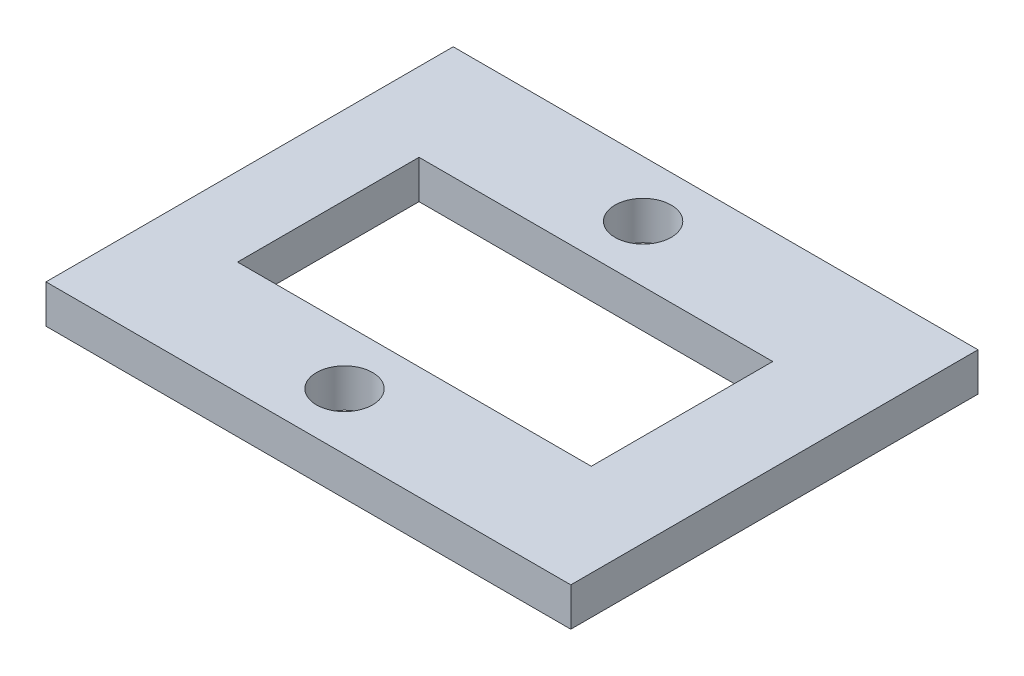
ISO-10303-21;
HEADER;
FILE_DESCRIPTION(('STEP AP214'),'2;1');
FILE_NAME('part.step','',(''),(''),'','','');
FILE_SCHEMA(('AUTOMOTIVE_DESIGN { 1 0 10303 214 1 1 1 1 }'));
ENDSEC;
DATA;
#1=APPLICATION_CONTEXT('core data for automotive mechanical design processes');
#2=APPLICATION_PROTOCOL_DEFINITION('international standard','automotive_design',2000,#1);
#3=PRODUCT_CONTEXT('',#1,'mechanical');
#4=PRODUCT('Part','Part','',(#3));
#5=PRODUCT_RELATED_PRODUCT_CATEGORY('part','',(#4));
#6=PRODUCT_DEFINITION_FORMATION('','',#4);
#7=PRODUCT_DEFINITION_CONTEXT('part definition',#1,'design');
#8=PRODUCT_DEFINITION('design','',#6,#7);
#9=PRODUCT_DEFINITION_SHAPE('','',#8);
#10=(LENGTH_UNIT() NAMED_UNIT(*) SI_UNIT(.MILLI.,.METRE.));
#11=(NAMED_UNIT(*) PLANE_ANGLE_UNIT() SI_UNIT($,.RADIAN.));
#12=(NAMED_UNIT(*) SI_UNIT($,.STERADIAN.) SOLID_ANGLE_UNIT());
#13=UNCERTAINTY_MEASURE_WITH_UNIT(LENGTH_MEASURE(1.E-05),#10,'distance_accuracy_value','');
#14=(GEOMETRIC_REPRESENTATION_CONTEXT(3) GLOBAL_UNCERTAINTY_ASSIGNED_CONTEXT((#13)) GLOBAL_UNIT_ASSIGNED_CONTEXT((#10,
#11,#12)) REPRESENTATION_CONTEXT('',''));
#15=CARTESIAN_POINT('',(0.,0.,0.));
#16=DIRECTION('',(0.,0.,1.));
#17=DIRECTION('',(1.,0.,0.));
#18=AXIS2_PLACEMENT_3D('',#15,#16,#17);
#19=CARTESIAN_POINT('',(0.,1.25,0.));
#20=DIRECTION('',(0.,1.,0.));
#21=DIRECTION('',(0.,0.,1.));
#22=AXIS2_PLACEMENT_3D('',#19,#20,#21);
#23=PLANE('',#22);
#24=CARTESIAN_POINT('',(-0.702610465116271,1.25,-10.3664818651471));
#25=DIRECTION('',(0.,1.,0.));
#26=DIRECTION('',(0.,0.,1.));
#27=AXIS2_PLACEMENT_3D('',#24,#25,#26);
#28=CIRCLE('',#27,1.825);
#29=CARTESIAN_POINT('',(-0.702610465116271,1.25,-8.54148186514709));
#30=VERTEX_POINT('',#29);
#31=EDGE_CURVE('E140',#30,#30,#28,.T.);
#32=ORIENTED_EDGE('',*,*,#31,.F.);
#33=EDGE_LOOP('',(#32));
#34=FACE_BOUND('',#33,.T.);
#35=DIRECTION('',(0.,0.,1.));
#36=VECTOR('',#35,1.);
#37=CARTESIAN_POINT('',(-16.7014916384778,1.25,-14.0165789852008));
#38=LINE('',#37,#36);
#39=CARTESIAN_POINT('',(-16.7014916384778,1.25,-14.0165789852008));
#40=VERTEX_POINT('',#39);
#41=CARTESIAN_POINT('',(-16.7014916384778,1.25,12.4615737843552));
#42=VERTEX_POINT('',#41);
#43=EDGE_CURVE('E156',#40,#42,#38,.T.);
#44=ORIENTED_EDGE('',*,*,#43,.T.);
#45=DIRECTION('',(1.,0.,0.));
#46=VECTOR('',#45,1.);
#47=CARTESIAN_POINT('',(-16.7014916384778,1.25,12.4615737843552));
#48=LINE('',#47,#46);
#49=CARTESIAN_POINT('',(17.4229383615222,1.25,12.4615737843552));
#50=VERTEX_POINT('',#49);
#51=EDGE_CURVE('E160',#42,#50,#48,.T.);
#52=ORIENTED_EDGE('',*,*,#51,.T.);
#53=DIRECTION('',(0.,0.,-1.));
#54=VECTOR('',#53,1.);
#55=CARTESIAN_POINT('',(17.4229383615222,1.25,-14.0165789852008));
#56=LINE('',#55,#54);
#57=CARTESIAN_POINT('',(17.4229383615222,1.25,-14.0165789852008));
#58=VERTEX_POINT('',#57);
#59=EDGE_CURVE('E164',#50,#58,#56,.T.);
#60=ORIENTED_EDGE('',*,*,#59,.T.);
#61=DIRECTION('',(-1.,0.,0.));
#62=VECTOR('',#61,1.);
#63=CARTESIAN_POINT('',(-16.7014916384778,1.25,-14.0165789852008));
#64=LINE('',#63,#62);
#65=EDGE_CURVE('E167',#58,#40,#64,.T.);
#66=ORIENTED_EDGE('',*,*,#65,.T.);
#67=EDGE_LOOP('',(#44,#52,#60,#66));
#68=FACE_BOUND('',#67,.T.);
#69=DIRECTION('',(1.,0.,0.));
#70=VECTOR('',#69,1.);
#71=CARTESIAN_POINT('',(11.4112391266143,1.25,5.11890739957716));
#72=LINE('',#71,#70);
#73=CARTESIAN_POINT('',(-11.5887608733857,1.25,5.11890739957716));
#74=VERTEX_POINT('',#73);
#75=CARTESIAN_POINT('',(11.4112391266143,1.25,5.11890739957716));
#76=VERTEX_POINT('',#75);
#77=EDGE_CURVE('E114',#74,#76,#72,.T.);
#78=ORIENTED_EDGE('',*,*,#77,.F.);
#79=DIRECTION('',(0.,0.,1.));
#80=VECTOR('',#79,1.);
#81=CARTESIAN_POINT('',(-11.5887608733857,1.25,5.11890739957716));
#82=LINE('',#81,#80);
#83=CARTESIAN_POINT('',(-11.5887608733857,1.25,-6.68088260042284));
#84=VERTEX_POINT('',#83);
#85=EDGE_CURVE('E105',#84,#74,#82,.T.);
#86=ORIENTED_EDGE('',*,*,#85,.F.);
#87=DIRECTION('',(-1.,0.,0.));
#88=VECTOR('',#87,1.);
#89=CARTESIAN_POINT('',(-11.5887608733857,1.25,-6.68088260042284));
#90=LINE('',#89,#88);
#91=CARTESIAN_POINT('',(11.4112391266143,1.25,-6.68088260042284));
#92=VERTEX_POINT('',#91);
#93=EDGE_CURVE('E132',#92,#84,#90,.T.);
#94=ORIENTED_EDGE('',*,*,#93,.F.);
#95=DIRECTION('',(0.,0.,-1.));
#96=VECTOR('',#95,1.);
#97=CARTESIAN_POINT('',(11.4112391266143,1.25,-6.68088260042284));
#98=LINE('',#97,#96);
#99=EDGE_CURVE('E128',#76,#92,#98,.T.);
#100=ORIENTED_EDGE('',*,*,#99,.F.);
#101=EDGE_LOOP('',(#78,#86,#94,#100));
#102=FACE_BOUND('',#101,.T.);
#103=CARTESIAN_POINT('',(-0.978049999999997,1.25,8.77351813485291));
#104=DIRECTION('',(0.,1.,0.));
#105=DIRECTION('',(0.,0.,1.));
#106=AXIS2_PLACEMENT_3D('',#103,#104,#105);
#107=CIRCLE('',#106,1.825);
#108=CARTESIAN_POINT('',(-0.978049999999997,1.25,10.5985181348529));
#109=VERTEX_POINT('',#108);
#110=EDGE_CURVE('E257',#109,#109,#107,.T.);
#111=ORIENTED_EDGE('',*,*,#110,.F.);
#112=EDGE_LOOP('',(#111));
#113=FACE_BOUND('',#112,.T.);
#114=ADVANCED_FACE('F39',(#34,#68,#102,#113),#23,.T.);
#115=CARTESIAN_POINT('',(0.,-1.25,0.));
#116=DIRECTION('',(0.,1.,0.));
#117=DIRECTION('',(0.,0.,1.));
#118=AXIS2_PLACEMENT_3D('',#115,#116,#117);
#119=PLANE('',#118);
#120=DIRECTION('',(0.,0.,1.));
#121=VECTOR('',#120,1.);
#122=CARTESIAN_POINT('',(-16.7014916384778,-1.25,-14.0165789852008));
#123=LINE('',#122,#121);
#124=CARTESIAN_POINT('',(-16.7014916384778,-1.25,-14.0165789852008));
#125=VERTEX_POINT('',#124);
#126=CARTESIAN_POINT('',(-16.7014916384778,-1.25,12.4615737843552));
#127=VERTEX_POINT('',#126);
#128=EDGE_CURVE('E123',#125,#127,#123,.T.);
#129=ORIENTED_EDGE('',*,*,#128,.F.);
#130=DIRECTION('',(-1.,0.,0.));
#131=VECTOR('',#130,1.);
#132=CARTESIAN_POINT('',(-16.7014916384778,-1.25,-14.0165789852008));
#133=LINE('',#132,#131);
#134=CARTESIAN_POINT('',(17.4229383615222,-1.25,-14.0165789852008));
#135=VERTEX_POINT('',#134);
#136=EDGE_CURVE('E161',#135,#125,#133,.T.);
#137=ORIENTED_EDGE('',*,*,#136,.F.);
#138=DIRECTION('',(0.,0.,-1.));
#139=VECTOR('',#138,1.);
#140=CARTESIAN_POINT('',(17.4229383615222,-1.25,-14.0165789852008));
#141=LINE('',#140,#139);
#142=CARTESIAN_POINT('',(17.4229383615222,-1.25,12.4615737843552));
#143=VERTEX_POINT('',#142);
#144=EDGE_CURVE('E177',#143,#135,#141,.T.);
#145=ORIENTED_EDGE('',*,*,#144,.F.);
#146=DIRECTION('',(1.,0.,0.));
#147=VECTOR('',#146,1.);
#148=CARTESIAN_POINT('',(-16.7014916384778,-1.25,12.4615737843552));
#149=LINE('',#148,#147);
#150=EDGE_CURVE('E174',#127,#143,#149,.T.);
#151=ORIENTED_EDGE('',*,*,#150,.F.);
#152=EDGE_LOOP('',(#129,#137,#145,#151));
#153=FACE_BOUND('',#152,.T.);
#154=DIRECTION('',(0.,0.,1.));
#155=VECTOR('',#154,1.);
#156=CARTESIAN_POINT('',(-11.5887608733857,-1.25,5.11890739957716));
#157=LINE('',#156,#155);
#158=CARTESIAN_POINT('',(-11.5887608733857,-1.25,-6.68088260042284));
#159=VERTEX_POINT('',#158);
#160=CARTESIAN_POINT('',(-11.5887608733857,-1.25,5.11890739957716));
#161=VERTEX_POINT('',#160);
#162=EDGE_CURVE('E63',#159,#161,#157,.T.);
#163=ORIENTED_EDGE('',*,*,#162,.T.);
#164=DIRECTION('',(1.,0.,0.));
#165=VECTOR('',#164,1.);
#166=CARTESIAN_POINT('',(11.4112391266143,-1.25,5.11890739957716));
#167=LINE('',#166,#165);
#168=CARTESIAN_POINT('',(11.4112391266143,-1.25,5.11890739957716));
#169=VERTEX_POINT('',#168);
#170=EDGE_CURVE('E121',#161,#169,#167,.T.);
#171=ORIENTED_EDGE('',*,*,#170,.T.);
#172=DIRECTION('',(0.,0.,-1.));
#173=VECTOR('',#172,1.);
#174=CARTESIAN_POINT('',(11.4112391266143,-1.25,-6.68088260042284));
#175=LINE('',#174,#173);
#176=CARTESIAN_POINT('',(11.4112391266143,-1.25,-6.68088260042284));
#177=VERTEX_POINT('',#176);
#178=EDGE_CURVE('E143',#169,#177,#175,.T.);
#179=ORIENTED_EDGE('',*,*,#178,.T.);
#180=DIRECTION('',(-1.,0.,0.));
#181=VECTOR('',#180,1.);
#182=CARTESIAN_POINT('',(-11.5887608733857,-1.25,-6.68088260042284));
#183=LINE('',#182,#181);
#184=EDGE_CURVE('E115',#177,#159,#183,.T.);
#185=ORIENTED_EDGE('',*,*,#184,.T.);
#186=EDGE_LOOP('',(#163,#171,#179,#185));
#187=FACE_BOUND('',#186,.T.);
#188=CARTESIAN_POINT('',(-0.702610465116271,-1.25,-10.3664818651471));
#189=DIRECTION('',(0.,1.,0.));
#190=DIRECTION('',(0.,0.,1.));
#191=AXIS2_PLACEMENT_3D('',#188,#189,#190);
#192=CIRCLE('',#191,1.825);
#193=CARTESIAN_POINT('',(-0.702610465116271,-1.25,-8.54148186514709));
#194=VERTEX_POINT('',#193);
#195=EDGE_CURVE('E265',#194,#194,#192,.T.);
#196=ORIENTED_EDGE('',*,*,#195,.T.);
#197=EDGE_LOOP('',(#196));
#198=FACE_BOUND('',#197,.T.);
#199=CARTESIAN_POINT('',(-0.978049999999997,-1.25,8.77351813485291));
#200=DIRECTION('',(0.,1.,0.));
#201=DIRECTION('',(0.,0.,1.));
#202=AXIS2_PLACEMENT_3D('',#199,#200,#201);
#203=CIRCLE('',#202,1.825);
#204=CARTESIAN_POINT('',(-0.978049999999997,-1.25,10.5985181348529));
#205=VERTEX_POINT('',#204);
#206=EDGE_CURVE('E260',#205,#205,#203,.T.);
#207=ORIENTED_EDGE('',*,*,#206,.T.);
#208=EDGE_LOOP('',(#207));
#209=FACE_BOUND('',#208,.T.);
#210=ADVANCED_FACE('F200',(#153,#187,#198,#209),#119,.F.);
#211=CARTESIAN_POINT('',(-16.7014916384778,1.25,-14.0165789852008));
#212=DIRECTION('',(1.,0.,0.));
#213=DIRECTION('',(0.,0.,-1.));
#214=AXIS2_PLACEMENT_3D('',#211,#212,#213);
#215=PLANE('',#214);
#216=ORIENTED_EDGE('',*,*,#128,.T.);
#217=DIRECTION('',(0.,-1.,0.));
#218=VECTOR('',#217,1.);
#219=CARTESIAN_POINT('',(-16.7014916384778,1.25,12.4615737843552));
#220=LINE('',#219,#218);
#221=EDGE_CURVE('E11',#42,#127,#220,.T.);
#222=ORIENTED_EDGE('',*,*,#221,.F.);
#223=ORIENTED_EDGE('',*,*,#43,.F.);
#224=DIRECTION('',(0.,-1.,0.));
#225=VECTOR('',#224,1.);
#226=CARTESIAN_POINT('',(-16.7014916384778,1.25,-14.0165789852008));
#227=LINE('',#226,#225);
#228=EDGE_CURVE('E170',#40,#125,#227,.T.);
#229=ORIENTED_EDGE('',*,*,#228,.T.);
#230=EDGE_LOOP('',(#216,#222,#223,#229));
#231=FACE_BOUND('',#230,.T.);
#232=ADVANCED_FACE('F41',(#231),#215,.F.);
#233=CARTESIAN_POINT('',(-16.7014916384778,1.25,12.4615737843552));
#234=DIRECTION('',(0.,0.,-1.));
#235=DIRECTION('',(-1.,0.,0.));
#236=AXIS2_PLACEMENT_3D('',#233,#234,#235);
#237=PLANE('',#236);
#238=ORIENTED_EDGE('',*,*,#150,.T.);
#239=DIRECTION('',(0.,-1.,0.));
#240=VECTOR('',#239,1.);
#241=CARTESIAN_POINT('',(17.4229383615222,1.25,12.4615737843552));
#242=LINE('',#241,#240);
#243=EDGE_CURVE('E48',#50,#143,#242,.T.);
#244=ORIENTED_EDGE('',*,*,#243,.F.);
#245=ORIENTED_EDGE('',*,*,#51,.F.);
#246=ORIENTED_EDGE('',*,*,#221,.T.);
#247=EDGE_LOOP('',(#238,#244,#245,#246));
#248=FACE_BOUND('',#247,.T.);
#249=ADVANCED_FACE('F210',(#248),#237,.F.);
#250=CARTESIAN_POINT('',(17.4229383615222,1.25,-14.0165789852008));
#251=DIRECTION('',(-1.,0.,0.));
#252=DIRECTION('',(0.,0.,1.));
#253=AXIS2_PLACEMENT_3D('',#250,#251,#252);
#254=PLANE('',#253);
#255=ORIENTED_EDGE('',*,*,#144,.T.);
#256=DIRECTION('',(0.,-1.,0.));
#257=VECTOR('',#256,1.);
#258=CARTESIAN_POINT('',(17.4229383615222,1.25,-14.0165789852008));
#259=LINE('',#258,#257);
#260=EDGE_CURVE('E185',#58,#135,#259,.T.);
#261=ORIENTED_EDGE('',*,*,#260,.F.);
#262=ORIENTED_EDGE('',*,*,#59,.F.);
#263=ORIENTED_EDGE('',*,*,#243,.T.);
#264=EDGE_LOOP('',(#255,#261,#262,#263));
#265=FACE_BOUND('',#264,.T.);
#266=ADVANCED_FACE('F194',(#265),#254,.F.);
#267=CARTESIAN_POINT('',(-16.7014916384778,1.25,-14.0165789852008));
#268=DIRECTION('',(0.,0.,1.));
#269=DIRECTION('',(1.,0.,0.));
#270=AXIS2_PLACEMENT_3D('',#267,#268,#269);
#271=PLANE('',#270);
#272=ORIENTED_EDGE('',*,*,#136,.T.);
#273=ORIENTED_EDGE('',*,*,#228,.F.);
#274=ORIENTED_EDGE('',*,*,#65,.F.);
#275=ORIENTED_EDGE('',*,*,#260,.T.);
#276=EDGE_LOOP('',(#272,#273,#274,#275));
#277=FACE_BOUND('',#276,.T.);
#278=ADVANCED_FACE('F204',(#277),#271,.F.);
#279=CARTESIAN_POINT('',(-11.5887608733857,1.25,5.11890739957716));
#280=DIRECTION('',(1.,0.,0.));
#281=DIRECTION('',(0.,0.,-1.));
#282=AXIS2_PLACEMENT_3D('',#279,#280,#281);
#283=PLANE('',#282);
#284=ORIENTED_EDGE('',*,*,#162,.F.);
#285=DIRECTION('',(0.,-1.,0.));
#286=VECTOR('',#285,1.);
#287=CARTESIAN_POINT('',(-11.5887608733857,1.25,-6.68088260042284));
#288=LINE('',#287,#286);
#289=EDGE_CURVE('E109',#84,#159,#288,.T.);
#290=ORIENTED_EDGE('',*,*,#289,.F.);
#291=ORIENTED_EDGE('',*,*,#85,.T.);
#292=DIRECTION('',(0.,-1.,0.));
#293=VECTOR('',#292,1.);
#294=CARTESIAN_POINT('',(-11.5887608733857,1.25,5.11890739957716));
#295=LINE('',#294,#293);
#296=EDGE_CURVE('E108',#74,#161,#295,.T.);
#297=ORIENTED_EDGE('',*,*,#296,.T.);
#298=EDGE_LOOP('',(#284,#290,#291,#297));
#299=FACE_BOUND('',#298,.T.);
#300=ADVANCED_FACE('F107',(#299),#283,.T.);
#301=CARTESIAN_POINT('',(11.4112391266143,1.25,5.11890739957716));
#302=DIRECTION('',(0.,0.,-1.));
#303=DIRECTION('',(-1.,0.,0.));
#304=AXIS2_PLACEMENT_3D('',#301,#302,#303);
#305=PLANE('',#304);
#306=ORIENTED_EDGE('',*,*,#170,.F.);
#307=ORIENTED_EDGE('',*,*,#296,.F.);
#308=ORIENTED_EDGE('',*,*,#77,.T.);
#309=DIRECTION('',(0.,-1.,0.));
#310=VECTOR('',#309,1.);
#311=CARTESIAN_POINT('',(11.4112391266143,1.25,5.11890739957716));
#312=LINE('',#311,#310);
#313=EDGE_CURVE('E124',#76,#169,#312,.T.);
#314=ORIENTED_EDGE('',*,*,#313,.T.);
#315=EDGE_LOOP('',(#306,#307,#308,#314));
#316=FACE_BOUND('',#315,.T.);
#317=ADVANCED_FACE('F118',(#316),#305,.T.);
#318=CARTESIAN_POINT('',(11.4112391266143,1.25,-6.68088260042284));
#319=DIRECTION('',(-1.,0.,0.));
#320=DIRECTION('',(0.,0.,1.));
#321=AXIS2_PLACEMENT_3D('',#318,#319,#320);
#322=PLANE('',#321);
#323=ORIENTED_EDGE('',*,*,#178,.F.);
#324=ORIENTED_EDGE('',*,*,#313,.F.);
#325=ORIENTED_EDGE('',*,*,#99,.T.);
#326=DIRECTION('',(0.,-1.,0.));
#327=VECTOR('',#326,1.);
#328=CARTESIAN_POINT('',(11.4112391266143,1.25,-6.68088260042284));
#329=LINE('',#328,#327);
#330=EDGE_CURVE('E55',#92,#177,#329,.T.);
#331=ORIENTED_EDGE('',*,*,#330,.T.);
#332=EDGE_LOOP('',(#323,#324,#325,#331));
#333=FACE_BOUND('',#332,.T.);
#334=ADVANCED_FACE('F235',(#333),#322,.T.);
#335=CARTESIAN_POINT('',(-11.5887608733857,1.25,-6.68088260042284));
#336=DIRECTION('',(0.,0.,1.));
#337=DIRECTION('',(1.,0.,0.));
#338=AXIS2_PLACEMENT_3D('',#335,#336,#337);
#339=PLANE('',#338);
#340=ORIENTED_EDGE('',*,*,#184,.F.);
#341=ORIENTED_EDGE('',*,*,#330,.F.);
#342=ORIENTED_EDGE('',*,*,#93,.T.);
#343=ORIENTED_EDGE('',*,*,#289,.T.);
#344=EDGE_LOOP('',(#340,#341,#342,#343));
#345=FACE_BOUND('',#344,.T.);
#346=ADVANCED_FACE('F239',(#345),#339,.T.);
#347=CARTESIAN_POINT('',(-0.702610465116271,1.25,-10.3664818651471));
#348=DIRECTION('',(0.,-1.,0.));
#349=DIRECTION('',(0.,0.,-1.));
#350=AXIS2_PLACEMENT_3D('',#347,#348,#349);
#351=CYLINDRICAL_SURFACE('',#350,1.825);
#352=ORIENTED_EDGE('',*,*,#31,.T.);
#353=EDGE_LOOP('',(#352));
#354=FACE_BOUND('',#353,.T.);
#355=ORIENTED_EDGE('',*,*,#195,.F.);
#356=EDGE_LOOP('',(#355));
#357=FACE_BOUND('',#356,.T.);
#358=ADVANCED_FACE('F245',(#354,#357),#351,.F.);
#359=CARTESIAN_POINT('',(-0.978049999999997,1.25,8.77351813485291));
#360=DIRECTION('',(0.,-1.,0.));
#361=DIRECTION('',(0.,0.,-1.));
#362=AXIS2_PLACEMENT_3D('',#359,#360,#361);
#363=CYLINDRICAL_SURFACE('',#362,1.825);
#364=ORIENTED_EDGE('',*,*,#110,.T.);
#365=EDGE_LOOP('',(#364));
#366=FACE_BOUND('',#365,.T.);
#367=ORIENTED_EDGE('',*,*,#206,.F.);
#368=EDGE_LOOP('',(#367));
#369=FACE_BOUND('',#368,.T.);
#370=ADVANCED_FACE('F248',(#366,#369),#363,.F.);
#371=CLOSED_SHELL('',(#114,#210,#232,#249,#266,#278,#300,#317,#334,#346,#358,#370));
#372=MANIFOLD_SOLID_BREP('B2',#371);
#373=ADVANCED_BREP_SHAPE_REPRESENTATION('',(#18,#372),#14);
#374=SHAPE_DEFINITION_REPRESENTATION(#9,#373);
ENDSEC;
END-ISO-10303-21;
